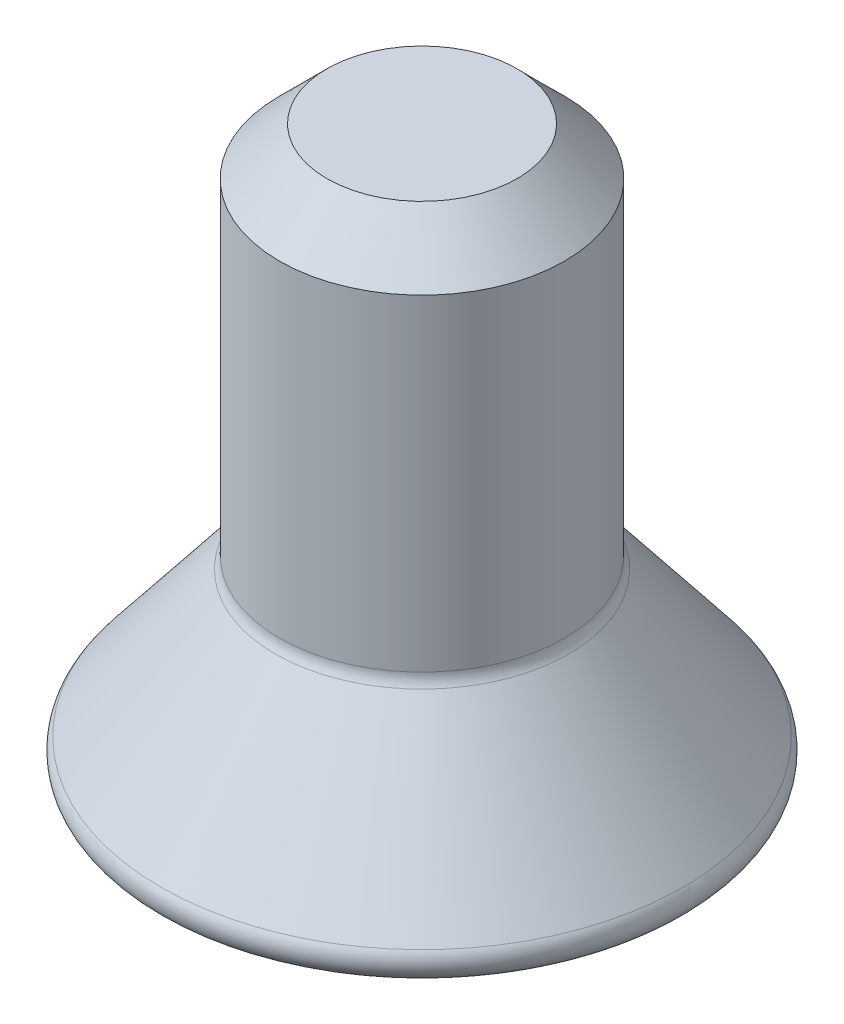
ISO-10303-21;
HEADER;
FILE_DESCRIPTION(('STEP AP214'),'2;1');
FILE_NAME('part.step','',(''),(''),'','','');
FILE_SCHEMA(('AUTOMOTIVE_DESIGN { 1 0 10303 214 1 1 1 1 }'));
ENDSEC;
DATA;
#1=APPLICATION_CONTEXT('core data for automotive mechanical design processes');
#2=APPLICATION_PROTOCOL_DEFINITION('international standard','automotive_design',2000,#1);
#3=PRODUCT_CONTEXT('',#1,'mechanical');
#4=PRODUCT('Part','Part','',(#3));
#5=PRODUCT_RELATED_PRODUCT_CATEGORY('part','',(#4));
#6=PRODUCT_DEFINITION_FORMATION('','',#4);
#7=PRODUCT_DEFINITION_CONTEXT('part definition',#1,'design');
#8=PRODUCT_DEFINITION('design','',#6,#7);
#9=PRODUCT_DEFINITION_SHAPE('','',#8);
#10=(LENGTH_UNIT() NAMED_UNIT(*) SI_UNIT(.MILLI.,.METRE.));
#11=(NAMED_UNIT(*) PLANE_ANGLE_UNIT() SI_UNIT($,.RADIAN.));
#12=(NAMED_UNIT(*) SI_UNIT($,.STERADIAN.) SOLID_ANGLE_UNIT());
#13=UNCERTAINTY_MEASURE_WITH_UNIT(LENGTH_MEASURE(1.E-05),#10,'distance_accuracy_value','');
#14=(GEOMETRIC_REPRESENTATION_CONTEXT(3) GLOBAL_UNCERTAINTY_ASSIGNED_CONTEXT((#13)) GLOBAL_UNIT_ASSIGNED_CONTEXT((#10,
#11,#12)) REPRESENTATION_CONTEXT('',''));
#15=CARTESIAN_POINT('',(0.,0.,0.));
#16=DIRECTION('',(0.,0.,1.));
#17=DIRECTION('',(1.,0.,0.));
#18=AXIS2_PLACEMENT_3D('',#15,#16,#17);
#19=CARTESIAN_POINT('',(0.,0.,0.));
#20=DIRECTION('',(0.,-1.,0.));
#21=DIRECTION('',(0.,0.,-1.));
#22=AXIS2_PLACEMENT_3D('',#19,#20,#21);
#23=CONICAL_SURFACE('',#22,3.,0.668289418830584);
#24=CARTESIAN_POINT('',(0.,1.84550363393513,0.));
#25=DIRECTION('',(0.,-1.,0.));
#26=DIRECTION('',(0.,0.,-1.));
#27=AXIS2_PLACEMENT_3D('',#24,#25,#26);
#28=CIRCLE('',#27,1.54302344689332);
#29=CARTESIAN_POINT('',(0.,1.84550363393513,-1.54302344689332));
#30=VERTEX_POINT('',#29);
#31=EDGE_CURVE('E56',#30,#30,#28,.T.);
#32=ORIENTED_EDGE('',*,*,#31,.T.);
#33=EDGE_LOOP('',(#32));
#34=FACE_BOUND('',#33,.T.);
#35=CARTESIAN_POINT('',(0.,0.323928857715805,0.));
#36=DIRECTION('',(0.,1.,0.));
#37=DIRECTION('',(0.,0.,1.));
#38=AXIS2_PLACEMENT_3D('',#35,#36,#37);
#39=CIRCLE('',#38,2.744266691277);
#40=CARTESIAN_POINT('',(0.,0.323928857715805,2.744266691277));
#41=VERTEX_POINT('',#40);
#42=EDGE_CURVE('E183',#41,#41,#39,.T.);
#43=ORIENTED_EDGE('',*,*,#42,.T.);
#44=EDGE_LOOP('',(#43));
#45=FACE_BOUND('',#44,.T.);
#46=ADVANCED_FACE('F47',(#34,#45),#23,.T.);
#47=CARTESIAN_POINT('',(3.,0.,0.));
#48=DIRECTION('',(0.,1.,0.));
#49=DIRECTION('',(0.,0.,1.));
#50=AXIS2_PLACEMENT_3D('',#47,#48,#49);
#51=PLANE('',#50);
#52=CARTESIAN_POINT('',(0.,0.,0.));
#53=DIRECTION('',(0.,1.,0.));
#54=DIRECTION('',(0.,0.,1.));
#55=AXIS2_PLACEMENT_3D('',#52,#53,#54);
#56=CIRCLE('',#55,2.58729013817031);
#57=CARTESIAN_POINT('',(0.,0.,2.58729013817031));
#58=VERTEX_POINT('',#57);
#59=EDGE_CURVE('E11',#58,#58,#56,.F.);
#60=ORIENTED_EDGE('',*,*,#59,.T.);
#61=EDGE_LOOP('',(#60));
#62=FACE_BOUND('',#61,.T.);
#63=DIRECTION('',(-0.866025403784439,0.,-0.5));
#64=VECTOR('',#63,1.);
#65=CARTESIAN_POINT('',(0.,0.,1.15470053837925));
#66=LINE('',#65,#64);
#67=CARTESIAN_POINT('',(0.,0.,1.15470053837925));
#68=VERTEX_POINT('',#67);
#69=CARTESIAN_POINT('',(-1.,0.,0.577350269189626));
#70=VERTEX_POINT('',#69);
#71=EDGE_CURVE('E143',#68,#70,#66,.T.);
#72=ORIENTED_EDGE('',*,*,#71,.F.);
#73=DIRECTION('',(-0.866025403784439,0.,0.5));
#74=VECTOR('',#73,1.);
#75=CARTESIAN_POINT('',(1.,0.,0.577350269189626));
#76=LINE('',#75,#74);
#77=CARTESIAN_POINT('',(1.,0.,0.577350269189626));
#78=VERTEX_POINT('',#77);
#79=EDGE_CURVE('E63',#78,#68,#76,.T.);
#80=ORIENTED_EDGE('',*,*,#79,.F.);
#81=DIRECTION('',(0.,0.,1.));
#82=VECTOR('',#81,1.);
#83=CARTESIAN_POINT('',(1.,0.,-0.577350269189626));
#84=LINE('',#83,#82);
#85=CARTESIAN_POINT('',(1.,0.,-0.577350269189626));
#86=VERTEX_POINT('',#85);
#87=EDGE_CURVE('E156',#86,#78,#84,.T.);
#88=ORIENTED_EDGE('',*,*,#87,.F.);
#89=DIRECTION('',(0.866025403784439,0.,0.5));
#90=VECTOR('',#89,1.);
#91=CARTESIAN_POINT('',(0.,0.,-1.15470053837925));
#92=LINE('',#91,#90);
#93=CARTESIAN_POINT('',(0.,0.,-1.15470053837925));
#94=VERTEX_POINT('',#93);
#95=EDGE_CURVE('E153',#94,#86,#92,.T.);
#96=ORIENTED_EDGE('',*,*,#95,.F.);
#97=DIRECTION('',(0.866025403784439,0.,-0.5));
#98=VECTOR('',#97,1.);
#99=CARTESIAN_POINT('',(-1.,0.,-0.577350269189626));
#100=LINE('',#99,#98);
#101=CARTESIAN_POINT('',(-1.,0.,-0.577350269189626));
#102=VERTEX_POINT('',#101);
#103=EDGE_CURVE('E111',#102,#94,#100,.T.);
#104=ORIENTED_EDGE('',*,*,#103,.F.);
#105=DIRECTION('',(0.,0.,-1.));
#106=VECTOR('',#105,1.);
#107=CARTESIAN_POINT('',(-1.,0.,0.577350269189626));
#108=LINE('',#107,#106);
#109=EDGE_CURVE('E147',#70,#102,#108,.T.);
#110=ORIENTED_EDGE('',*,*,#109,.F.);
#111=EDGE_LOOP('',(#72,#80,#88,#96,#104,#110));
#112=FACE_BOUND('',#111,.T.);
#113=ADVANCED_FACE('F202',(#62,#112),#51,.F.);
#114=CARTESIAN_POINT('',(0.,5.9,0.));
#115=DIRECTION('',(0.,-1.,0.));
#116=DIRECTION('',(0.,0.,-1.));
#117=AXIS2_PLACEMENT_3D('',#114,#115,#116);
#118=CYLINDRICAL_SURFACE('',#117,1.5);
#119=CARTESIAN_POINT('',(0.,1.96943249165094,0.));
#120=DIRECTION('',(0.,1.,0.));
#121=DIRECTION('',(0.,0.,1.));
#122=AXIS2_PLACEMENT_3D('',#119,#120,#121);
#123=CIRCLE('',#122,1.5);
#124=CARTESIAN_POINT('',(0.,1.96943249165094,1.5));
#125=VERTEX_POINT('',#124);
#126=EDGE_CURVE('E179',#125,#125,#123,.T.);
#127=ORIENTED_EDGE('',*,*,#126,.T.);
#128=EDGE_LOOP('',(#127));
#129=FACE_BOUND('',#128,.T.);
#130=CARTESIAN_POINT('',(0.,5.4,0.));
#131=DIRECTION('',(0.,1.,0.));
#132=DIRECTION('',(0.,0.,1.));
#133=AXIS2_PLACEMENT_3D('',#130,#131,#132);
#134=CIRCLE('',#133,1.5);
#135=CARTESIAN_POINT('',(0.,5.4,1.5));
#136=VERTEX_POINT('',#135);
#137=EDGE_CURVE('E175',#136,#136,#134,.F.);
#138=ORIENTED_EDGE('',*,*,#137,.T.);
#139=EDGE_LOOP('',(#138));
#140=FACE_BOUND('',#139,.T.);
#141=ADVANCED_FACE('F198',(#129,#140),#118,.T.);
#142=CARTESIAN_POINT('',(0.,5.9,0.));
#143=DIRECTION('',(0.,1.,0.));
#144=DIRECTION('',(0.,0.,1.));
#145=AXIS2_PLACEMENT_3D('',#142,#143,#144);
#146=PLANE('',#145);
#147=CARTESIAN_POINT('',(0.,5.9,0.));
#148=DIRECTION('',(0.,1.,0.));
#149=DIRECTION('',(0.,0.,1.));
#150=AXIS2_PLACEMENT_3D('',#147,#148,#149);
#151=CIRCLE('',#150,1.);
#152=CARTESIAN_POINT('',(0.,5.9,1.));
#153=VERTEX_POINT('',#152);
#154=EDGE_CURVE('E162',#153,#153,#151,.T.);
#155=ORIENTED_EDGE('',*,*,#154,.T.);
#156=EDGE_LOOP('',(#155));
#157=FACE_BOUND('',#156,.T.);
#158=ADVANCED_FACE('F201',(#157),#146,.T.);
#159=CARTESIAN_POINT('',(1.,1.,0.577350269189626));
#160=DIRECTION('',(0.5,0.,0.866025403784439));
#161=DIRECTION('',(0.866025403784439,0.,-0.5));
#162=AXIS2_PLACEMENT_3D('',#159,#160,#161);
#163=PLANE('',#162);
#164=ORIENTED_EDGE('',*,*,#79,.T.);
#165=DIRECTION('',(0.,-1.,0.));
#166=VECTOR('',#165,1.);
#167=CARTESIAN_POINT('',(0.,1.,1.15470053837925));
#168=LINE('',#167,#166);
#169=CARTESIAN_POINT('',(0.,1.,1.15470053837925));
#170=VERTEX_POINT('',#169);
#171=EDGE_CURVE('E93',#170,#68,#168,.T.);
#172=ORIENTED_EDGE('',*,*,#171,.F.);
#173=DIRECTION('',(-0.866025403784439,0.,0.5));
#174=VECTOR('',#173,1.);
#175=CARTESIAN_POINT('',(1.,1.,0.577350269189626));
#176=LINE('',#175,#174);
#177=CARTESIAN_POINT('',(1.,1.,0.577350269189626));
#178=VERTEX_POINT('',#177);
#179=EDGE_CURVE('E159',#178,#170,#176,.T.);
#180=ORIENTED_EDGE('',*,*,#179,.F.);
#181=DIRECTION('',(0.,-1.,0.));
#182=VECTOR('',#181,1.);
#183=CARTESIAN_POINT('',(1.,1.,0.577350269189626));
#184=LINE('',#183,#182);
#185=EDGE_CURVE('E71',#178,#78,#184,.T.);
#186=ORIENTED_EDGE('',*,*,#185,.T.);
#187=EDGE_LOOP('',(#164,#172,#180,#186));
#188=FACE_BOUND('',#187,.T.);
#189=ADVANCED_FACE('F212',(#188),#163,.F.);
#190=CARTESIAN_POINT('',(1.,1.,-0.577350269189626));
#191=DIRECTION('',(1.,0.,0.));
#192=DIRECTION('',(0.,0.,-1.));
#193=AXIS2_PLACEMENT_3D('',#190,#191,#192);
#194=PLANE('',#193);
#195=ORIENTED_EDGE('',*,*,#87,.T.);
#196=ORIENTED_EDGE('',*,*,#185,.F.);
#197=DIRECTION('',(0.,0.,1.));
#198=VECTOR('',#197,1.);
#199=CARTESIAN_POINT('',(1.,1.,-0.577350269189626));
#200=LINE('',#199,#198);
#201=CARTESIAN_POINT('',(1.,1.,-0.577350269189626));
#202=VERTEX_POINT('',#201);
#203=EDGE_CURVE('E125',#202,#178,#200,.T.);
#204=ORIENTED_EDGE('',*,*,#203,.F.);
#205=DIRECTION('',(0.,-1.,0.));
#206=VECTOR('',#205,1.);
#207=CARTESIAN_POINT('',(1.,1.,-0.577350269189626));
#208=LINE('',#207,#206);
#209=EDGE_CURVE('E116',#202,#86,#208,.T.);
#210=ORIENTED_EDGE('',*,*,#209,.T.);
#211=EDGE_LOOP('',(#195,#196,#204,#210));
#212=FACE_BOUND('',#211,.T.);
#213=ADVANCED_FACE('F218',(#212),#194,.F.);
#214=CARTESIAN_POINT('',(0.,1.,-1.15470053837925));
#215=DIRECTION('',(0.5,0.,-0.866025403784439));
#216=DIRECTION('',(-0.866025403784439,0.,-0.5));
#217=AXIS2_PLACEMENT_3D('',#214,#215,#216);
#218=PLANE('',#217);
#219=ORIENTED_EDGE('',*,*,#95,.T.);
#220=ORIENTED_EDGE('',*,*,#209,.F.);
#221=DIRECTION('',(0.866025403784439,0.,0.5));
#222=VECTOR('',#221,1.);
#223=CARTESIAN_POINT('',(0.,1.,-1.15470053837925));
#224=LINE('',#223,#222);
#225=CARTESIAN_POINT('',(0.,1.,-1.15470053837925));
#226=VERTEX_POINT('',#225);
#227=EDGE_CURVE('E120',#226,#202,#224,.T.);
#228=ORIENTED_EDGE('',*,*,#227,.F.);
#229=DIRECTION('',(0.,-1.,0.));
#230=VECTOR('',#229,1.);
#231=CARTESIAN_POINT('',(0.,1.,-1.15470053837925));
#232=LINE('',#231,#230);
#233=EDGE_CURVE('E104',#226,#94,#232,.T.);
#234=ORIENTED_EDGE('',*,*,#233,.T.);
#235=EDGE_LOOP('',(#219,#220,#228,#234));
#236=FACE_BOUND('',#235,.T.);
#237=ADVANCED_FACE('F121',(#236),#218,.F.);
#238=CARTESIAN_POINT('',(-1.,1.,-0.577350269189626));
#239=DIRECTION('',(-0.5,0.,-0.866025403784439));
#240=DIRECTION('',(-0.866025403784439,0.,0.5));
#241=AXIS2_PLACEMENT_3D('',#238,#239,#240);
#242=PLANE('',#241);
#243=ORIENTED_EDGE('',*,*,#103,.T.);
#244=ORIENTED_EDGE('',*,*,#233,.F.);
#245=DIRECTION('',(0.866025403784439,0.,-0.5));
#246=VECTOR('',#245,1.);
#247=CARTESIAN_POINT('',(-1.,1.,-0.577350269189626));
#248=LINE('',#247,#246);
#249=CARTESIAN_POINT('',(-1.,1.,-0.577350269189626));
#250=VERTEX_POINT('',#249);
#251=EDGE_CURVE('E108',#250,#226,#248,.T.);
#252=ORIENTED_EDGE('',*,*,#251,.F.);
#253=DIRECTION('',(0.,-1.,0.));
#254=VECTOR('',#253,1.);
#255=CARTESIAN_POINT('',(-1.,1.,-0.577350269189626));
#256=LINE('',#255,#254);
#257=EDGE_CURVE('E117',#250,#102,#256,.T.);
#258=ORIENTED_EDGE('',*,*,#257,.T.);
#259=EDGE_LOOP('',(#243,#244,#252,#258));
#260=FACE_BOUND('',#259,.T.);
#261=ADVANCED_FACE('F106',(#260),#242,.F.);
#262=CARTESIAN_POINT('',(-1.,1.,0.577350269189626));
#263=DIRECTION('',(-1.,0.,0.));
#264=DIRECTION('',(0.,0.,1.));
#265=AXIS2_PLACEMENT_3D('',#262,#263,#264);
#266=PLANE('',#265);
#267=ORIENTED_EDGE('',*,*,#109,.T.);
#268=ORIENTED_EDGE('',*,*,#257,.F.);
#269=DIRECTION('',(0.,0.,-1.));
#270=VECTOR('',#269,1.);
#271=CARTESIAN_POINT('',(-1.,1.,0.577350269189626));
#272=LINE('',#271,#270);
#273=CARTESIAN_POINT('',(-1.,1.,0.577350269189626));
#274=VERTEX_POINT('',#273);
#275=EDGE_CURVE('E131',#274,#250,#272,.T.);
#276=ORIENTED_EDGE('',*,*,#275,.F.);
#277=DIRECTION('',(0.,-1.,0.));
#278=VECTOR('',#277,1.);
#279=CARTESIAN_POINT('',(-1.,1.,0.577350269189626));
#280=LINE('',#279,#278);
#281=EDGE_CURVE('E167',#274,#70,#280,.T.);
#282=ORIENTED_EDGE('',*,*,#281,.T.);
#283=EDGE_LOOP('',(#267,#268,#276,#282));
#284=FACE_BOUND('',#283,.T.);
#285=ADVANCED_FACE('F252',(#284),#266,.F.);
#286=CARTESIAN_POINT('',(0.,1.,1.15470053837925));
#287=DIRECTION('',(-0.5,0.,0.866025403784439));
#288=DIRECTION('',(0.866025403784439,0.,0.5));
#289=AXIS2_PLACEMENT_3D('',#286,#287,#288);
#290=PLANE('',#289);
#291=ORIENTED_EDGE('',*,*,#71,.T.);
#292=ORIENTED_EDGE('',*,*,#281,.F.);
#293=DIRECTION('',(-0.866025403784439,0.,-0.5));
#294=VECTOR('',#293,1.);
#295=CARTESIAN_POINT('',(0.,1.,1.15470053837925));
#296=LINE('',#295,#294);
#297=EDGE_CURVE('E135',#170,#274,#296,.T.);
#298=ORIENTED_EDGE('',*,*,#297,.F.);
#299=ORIENTED_EDGE('',*,*,#171,.T.);
#300=EDGE_LOOP('',(#291,#292,#298,#299));
#301=FACE_BOUND('',#300,.T.);
#302=ADVANCED_FACE('F238',(#301),#290,.F.);
#303=CARTESIAN_POINT('',(0.,1.,0.));
#304=DIRECTION('',(0.,-1.,0.));
#305=DIRECTION('',(0.,0.,-1.));
#306=AXIS2_PLACEMENT_3D('',#303,#304,#305);
#307=PLANE('',#306);
#308=ORIENTED_EDGE('',*,*,#179,.T.);
#309=ORIENTED_EDGE('',*,*,#297,.T.);
#310=ORIENTED_EDGE('',*,*,#275,.T.);
#311=ORIENTED_EDGE('',*,*,#251,.T.);
#312=ORIENTED_EDGE('',*,*,#227,.T.);
#313=ORIENTED_EDGE('',*,*,#203,.T.);
#314=EDGE_LOOP('',(#308,#309,#310,#311,#312,#313));
#315=FACE_BOUND('',#314,.T.);
#316=ADVANCED_FACE('F128',(#315),#307,.T.);
#317=CARTESIAN_POINT('',(0.,5.9,0.));
#318=DIRECTION('',(0.,-1.,0.));
#319=DIRECTION('',(0.,0.,-1.));
#320=AXIS2_PLACEMENT_3D('',#317,#318,#319);
#321=CONICAL_SURFACE('',#320,1.,0.785398163397446);
#322=ORIENTED_EDGE('',*,*,#137,.F.);
#323=EDGE_LOOP('',(#322));
#324=FACE_BOUND('',#323,.T.);
#325=ORIENTED_EDGE('',*,*,#154,.F.);
#326=EDGE_LOOP('',(#325));
#327=FACE_BOUND('',#326,.T.);
#328=ADVANCED_FACE('F195',(#324,#327),#321,.T.);
#329=CARTESIAN_POINT('',(0.,1.96943249165094,0.));
#330=DIRECTION('',(0.,1.,0.));
#331=DIRECTION('',(0.,0.,1.));
#332=AXIS2_PLACEMENT_3D('',#329,#330,#331);
#333=TOROIDAL_SURFACE('',#332,1.7,0.2);
#334=ORIENTED_EDGE('',*,*,#31,.F.);
#335=EDGE_LOOP('',(#334));
#336=FACE_BOUND('',#335,.T.);
#337=ORIENTED_EDGE('',*,*,#126,.F.);
#338=EDGE_LOOP('',(#337));
#339=FACE_BOUND('',#338,.T.);
#340=ADVANCED_FACE('F192',(#336,#339),#333,.F.);
#341=CARTESIAN_POINT('',(0.,0.2,0.));
#342=DIRECTION('',(0.,1.,0.));
#343=DIRECTION('',(0.,0.,1.));
#344=AXIS2_PLACEMENT_3D('',#341,#342,#343);
#345=TOROIDAL_SURFACE('',#344,2.58729013817031,0.2);
#346=ORIENTED_EDGE('',*,*,#59,.F.);
#347=EDGE_LOOP('',(#346));
#348=FACE_BOUND('',#347,.T.);
#349=ORIENTED_EDGE('',*,*,#42,.F.);
#350=EDGE_LOOP('',(#349));
#351=FACE_BOUND('',#350,.T.);
#352=ADVANCED_FACE('F49',(#348,#351),#345,.T.);
#353=CLOSED_SHELL('',(#46,#113,#141,#158,#189,#213,#237,#261,#285,#302,#316,#328,#340,#352));
#354=MANIFOLD_SOLID_BREP('B2',#353);
#355=ADVANCED_BREP_SHAPE_REPRESENTATION('',(#18,#354),#14);
#356=SHAPE_DEFINITION_REPRESENTATION(#9,#355);
ENDSEC;
END-ISO-10303-21;
